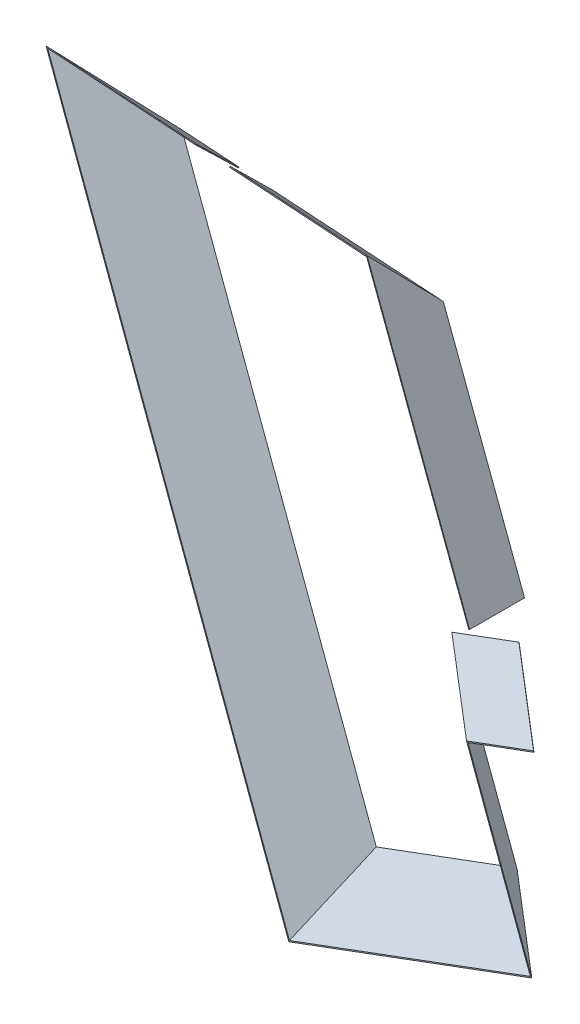
ISO-10303-21;
HEADER;
FILE_DESCRIPTION(('STEP AP214'),'2;1');
FILE_NAME('part.step','',(''),(''),'','','');
FILE_SCHEMA(('AUTOMOTIVE_DESIGN { 1 0 10303 214 1 1 1 1 }'));
ENDSEC;
DATA;
#1=APPLICATION_CONTEXT('core data for automotive mechanical design processes');
#2=APPLICATION_PROTOCOL_DEFINITION('international standard','automotive_design',2000,#1);
#3=PRODUCT_CONTEXT('',#1,'mechanical');
#4=PRODUCT('Part','Part','',(#3));
#5=PRODUCT_RELATED_PRODUCT_CATEGORY('part','',(#4));
#6=PRODUCT_DEFINITION_FORMATION('','',#4);
#7=PRODUCT_DEFINITION_CONTEXT('part definition',#1,'design');
#8=PRODUCT_DEFINITION('design','',#6,#7);
#9=PRODUCT_DEFINITION_SHAPE('','',#8);
#10=(LENGTH_UNIT() NAMED_UNIT(*) SI_UNIT(.MILLI.,.METRE.));
#11=(NAMED_UNIT(*) PLANE_ANGLE_UNIT() SI_UNIT($,.RADIAN.));
#12=(NAMED_UNIT(*) SI_UNIT($,.STERADIAN.) SOLID_ANGLE_UNIT());
#13=UNCERTAINTY_MEASURE_WITH_UNIT(LENGTH_MEASURE(1.E-05),#10,'distance_accuracy_value','');
#14=(GEOMETRIC_REPRESENTATION_CONTEXT(3) GLOBAL_UNCERTAINTY_ASSIGNED_CONTEXT((#13)) GLOBAL_UNIT_ASSIGNED_CONTEXT((#10,
#11,#12)) REPRESENTATION_CONTEXT('',''));
#15=CARTESIAN_POINT('',(0.,0.,0.));
#16=DIRECTION('',(0.,0.,1.));
#17=DIRECTION('',(1.,0.,0.));
#18=AXIS2_PLACEMENT_3D('',#15,#16,#17);
#19=CARTESIAN_POINT('',(74484.3531995962,28002.7639113801,2.23020576184523E-09));
#20=DIRECTION('',(0.936034964792815,0.351907011418235,0.));
#21=DIRECTION('',(-0.351907011418235,0.936034964792815,0.));
#22=AXIS2_PLACEMENT_3D('',#19,#20,#21);
#23=PLANE('',#22);
#24=DIRECTION('',(-0.351907011418235,0.936034964792815,0.));
#25=VECTOR('',#24,1.);
#26=CARTESIAN_POINT('',(49986.4237664351,93164.6327302221,-1.42554691415152E-11));
#27=LINE('',#26,#25);
#28=CARTESIAN_POINT('',(50090.9368637953,92886.6390835094,0.));
#29=VERTEX_POINT('',#28);
#30=CARTESIAN_POINT('',(49986.4237664351,93164.6327302221,-1.42554691415152E-11));
#31=VERTEX_POINT('',#30);
#32=EDGE_CURVE('E167',#29,#31,#27,.T.);
#33=ORIENTED_EDGE('',*,*,#32,.F.);
#34=DIRECTION('',(-0.260150224686482,0.691971738283521,0.67342183957194));
#35=VECTOR('',#34,1.);
#36=CARTESIAN_POINT('',(50090.9368637953,92886.6390835094,0.));
#37=LINE('',#36,#35);
#38=CARTESIAN_POINT('',(54796.2041279153,80371.1320461216,-12180.));
#39=VERTEX_POINT('',#38);
#40=EDGE_CURVE('E178',#39,#29,#37,.T.);
#41=ORIENTED_EDGE('',*,*,#40,.F.);
#42=DIRECTION('',(0.351907011418277,-0.936034964792799,0.));
#43=VECTOR('',#42,1.);
#44=CARTESIAN_POINT('',(54691.6910305552,80649.1256928343,-12180.));
#45=LINE('',#44,#43);
#46=CARTESIAN_POINT('',(54691.6910305552,80649.1256928343,-12180.));
#47=VERTEX_POINT('',#46);
#48=EDGE_CURVE('E169',#47,#39,#45,.T.);
#49=ORIENTED_EDGE('',*,*,#48,.F.);
#50=DIRECTION('',(0.260150224686481,-0.691971738283521,-0.67342183957194));
#51=VECTOR('',#50,1.);
#52=CARTESIAN_POINT('',(49986.4237664351,93164.6327302221,-1.42554691415152E-11));
#53=LINE('',#52,#51);
#54=EDGE_CURVE('E159',#31,#47,#53,.T.);
#55=ORIENTED_EDGE('',*,*,#54,.F.);
#56=EDGE_LOOP('',(#33,#41,#49,#55));
#57=FACE_BOUND('',#56,.T.);
#58=ADVANCED_FACE('F117',(#57),#23,.T.);
#59=CARTESIAN_POINT('',(-2250.07372456547,96326.5072499758,0.));
#60=DIRECTION('',(0.0463712521045221,0.705584656138623,-0.707106781186547));
#61=DIRECTION('',(0.,0.707868252835824,0.706344488636499));
#62=AXIS2_PLACEMENT_3D('',#59,#60,#61);
#63=PLANE('',#62);
#64=DIRECTION('',(0.997847390113597,-0.065578853630437,0.));
#65=VECTOR('',#64,1.);
#66=CARTESIAN_POINT('',(-2250.07372456547,96326.5072499758,0.));
#67=LINE('',#66,#65);
#68=CARTESIAN_POINT('',(19720.1344878937,94882.6180512166,2.22044604925031E-13));
#69=VERTEX_POINT('',#68);
#70=EDGE_CURVE('E172',#69,#29,#67,.T.);
#71=ORIENTED_EDGE('',*,*,#70,.F.);
#72=DIRECTION('',(-0.153049280511773,-0.694492078488884,-0.703033904339626));
#73=VECTOR('',#72,1.);
#74=CARTESIAN_POINT('',(19358.9756907871,93243.7869320606,-1658.98773497955));
#75=LINE('',#74,#73);
#76=CARTESIAN_POINT('',(17068.569285808,82850.6044260128,-12180.));
#77=VERTEX_POINT('',#76);
#78=EDGE_CURVE('E121',#69,#77,#75,.T.);
#79=ORIENTED_EDGE('',*,*,#78,.T.);
#80=DIRECTION('',(0.997847390113597,-0.065578853630437,0.));
#81=VECTOR('',#80,1.);
#82=CARTESIAN_POINT('',(2455.19353955456,83811.0002125879,-12180.));
#83=LINE('',#82,#81);
#84=EDGE_CURVE('E181',#77,#39,#83,.T.);
#85=ORIENTED_EDGE('',*,*,#84,.T.);
#86=ORIENTED_EDGE('',*,*,#40,.T.);
#87=EDGE_LOOP('',(#71,#79,#85,#86));
#88=FACE_BOUND('',#87,.T.);
#89=ADVANCED_FACE('F190',(#88),#63,.F.);
#90=CARTESIAN_POINT('',(2350.68044219438,84088.9938593006,-12180.));
#91=DIRECTION('',(0.,0.,1.));
#92=DIRECTION('',(0.,-1.,0.));
#93=AXIS2_PLACEMENT_3D('',#90,#91,#92);
#94=PLANE('',#93);
#95=ORIENTED_EDGE('',*,*,#84,.F.);
#96=DIRECTION('',(0.215211864822324,0.976567382846518,0.));
#97=VECTOR('',#96,1.);
#98=CARTESIAN_POINT('',(16647.164315719,80938.3941066698,-12179.9999999999));
#99=LINE('',#98,#97);
#100=CARTESIAN_POINT('',(17127.4656835186,83117.8587477893,-12180.));
#101=VERTEX_POINT('',#100);
#102=EDGE_CURVE('E187',#77,#101,#99,.T.);
#103=ORIENTED_EDGE('',*,*,#102,.T.);
#104=DIRECTION('',(0.997847390113597,-0.065578853630437,0.));
#105=VECTOR('',#104,1.);
#106=CARTESIAN_POINT('',(2350.68044219438,84088.9938593006,-12180.));
#107=LINE('',#106,#105);
#108=EDGE_CURVE('E163',#101,#47,#107,.T.);
#109=ORIENTED_EDGE('',*,*,#108,.T.);
#110=ORIENTED_EDGE('',*,*,#48,.T.);
#111=EDGE_LOOP('',(#95,#103,#109,#110));
#112=FACE_BOUND('',#111,.T.);
#113=ADVANCED_FACE('F186',(#112),#94,.F.);
#114=CARTESIAN_POINT('',(-2354.58682192564,96604.5008966884,-1.42554691415152E-11));
#115=DIRECTION('',(-0.0463712521045221,-0.705584656138623,0.707106781186547));
#116=DIRECTION('',(0.,-0.707868252835824,-0.706344488636499));
#117=AXIS2_PLACEMENT_3D('',#114,#115,#116);
#118=PLANE('',#117);
#119=ORIENTED_EDGE('',*,*,#108,.F.);
#120=DIRECTION('',(0.153049280511773,0.694492078488884,0.703033904339626));
#121=VECTOR('',#120,1.);
#122=CARTESIAN_POINT('',(19415.1858701376,93498.8519944957,-1671.32691472151));
#123=LINE('',#122,#121);
#124=CARTESIAN_POINT('',(19779.0308856043,95149.8723729931,-1.3988810110277E-11));
#125=VERTEX_POINT('',#124);
#126=EDGE_CURVE('E126',#101,#125,#123,.T.);
#127=ORIENTED_EDGE('',*,*,#126,.T.);
#128=DIRECTION('',(0.997847390113597,-0.065578853630437,0.));
#129=VECTOR('',#128,1.);
#130=CARTESIAN_POINT('',(-2354.58682192564,96604.5008966884,-1.42554691415152E-11));
#131=LINE('',#130,#129);
#132=EDGE_CURVE('E156',#125,#31,#131,.T.);
#133=ORIENTED_EDGE('',*,*,#132,.T.);
#134=ORIENTED_EDGE('',*,*,#54,.T.);
#135=EDGE_LOOP('',(#119,#127,#133,#134));
#136=FACE_BOUND('',#135,.T.);
#137=ADVANCED_FACE('F158',(#136),#118,.F.);
#138=CARTESIAN_POINT('',(-2354.58682192564,96604.5008966884,-1.42554691415152E-11));
#139=DIRECTION('',(0.,0.,-1.));
#140=DIRECTION('',(0.,1.,0.));
#141=AXIS2_PLACEMENT_3D('',#138,#139,#140);
#142=PLANE('',#141);
#143=ORIENTED_EDGE('',*,*,#132,.F.);
#144=DIRECTION('',(-0.215211864822324,-0.976567382846518,0.));
#145=VECTOR('',#144,1.);
#146=CARTESIAN_POINT('',(19059.6046582034,91885.3302966345,1.60399321255634E-10));
#147=LINE('',#146,#145);
#148=EDGE_CURVE('E51',#125,#69,#147,.T.);
#149=ORIENTED_EDGE('',*,*,#148,.T.);
#150=ORIENTED_EDGE('',*,*,#70,.T.);
#151=ORIENTED_EDGE('',*,*,#32,.T.);
#152=EDGE_LOOP('',(#143,#149,#150,#151));
#153=FACE_BOUND('',#152,.T.);
#154=ADVANCED_FACE('F119',(#153),#142,.F.);
#155=CARTESIAN_POINT('',(21089.3356866246,101095.645536197,-12180.));
#156=DIRECTION('',(0.976567382846518,-0.215211864822324,0.));
#157=DIRECTION('',(0.215211864822324,0.976567382846518,0.));
#158=AXIS2_PLACEMENT_3D('',#155,#156,#157);
#159=PLANE('',#158);
#160=ORIENTED_EDGE('',*,*,#126,.F.);
#161=ORIENTED_EDGE('',*,*,#102,.F.);
#162=ORIENTED_EDGE('',*,*,#78,.F.);
#163=ORIENTED_EDGE('',*,*,#148,.F.);
#164=EDGE_LOOP('',(#160,#161,#162,#163));
#165=FACE_BOUND('',#164,.T.);
#166=ADVANCED_FACE('F204',(#165),#159,.F.);
#167=CLOSED_SHELL('',(#58,#89,#113,#137,#154,#166));
#168=MANIFOLD_SOLID_BREP('B6',#167);
#169=CARTESIAN_POINT('',(-1207.69140198509,3012.92936787344,9.91028632743769E-13));
#170=DIRECTION('',(0.372059755013049,-0.928208779693249,0.));
#171=DIRECTION('',(0.928208779693249,0.372059755013049,0.));
#172=AXIS2_PLACEMENT_3D('',#169,#170,#171);
#173=PLANE('',#172);
#174=DIRECTION('',(0.,0.,1.));
#175=VECTOR('',#174,1.);
#176=CARTESIAN_POINT('',(72921.9529815773,32726.7803160055,0.));
#177=LINE('',#176,#175);
#178=CARTESIAN_POINT('',(72921.9529815773,32726.7803160055,-12180.));
#179=VERTEX_POINT('',#178);
#180=CARTESIAN_POINT('',(72921.9529815773,32726.7803160055,0.));
#181=VERTEX_POINT('',#180);
#182=EDGE_CURVE('E307',#179,#181,#177,.T.);
#183=ORIENTED_EDGE('',*,*,#182,.T.);
#184=DIRECTION('',(-0.928208779693282,-0.372059755012967,0.));
#185=VECTOR('',#184,1.);
#186=CARTESIAN_POINT('',(72921.9529815773,32726.7803160055,0.));
#187=LINE('',#186,#185);
#188=CARTESIAN_POINT('',(72736.3112256387,32652.3683650029,0.));
#189=VERTEX_POINT('',#188);
#190=EDGE_CURVE('E298',#181,#189,#187,.T.);
#191=ORIENTED_EDGE('',*,*,#190,.T.);
#192=DIRECTION('',(0.,0.,-1.));
#193=VECTOR('',#192,1.);
#194=CARTESIAN_POINT('',(72736.3112256387,32652.3683650029,0.));
#195=LINE('',#194,#193);
#196=CARTESIAN_POINT('',(72736.3112256387,32652.3683650029,-12180.));
#197=VERTEX_POINT('',#196);
#198=EDGE_CURVE('E289',#189,#197,#195,.T.);
#199=ORIENTED_EDGE('',*,*,#198,.T.);
#200=DIRECTION('',(0.928208779693282,0.372059755012967,0.));
#201=VECTOR('',#200,1.);
#202=CARTESIAN_POINT('',(72921.9529815773,32726.7803160055,-12180.));
#203=LINE('',#202,#201);
#204=EDGE_CURVE('E304',#197,#179,#203,.T.);
#205=ORIENTED_EDGE('',*,*,#204,.T.);
#206=EDGE_LOOP('',(#183,#191,#199,#205));
#207=FACE_BOUND('',#206,.T.);
#208=ADVANCED_FACE('F250',(#207),#173,.T.);
#209=CARTESIAN_POINT('',(72921.9529815773,32726.7803160055,0.));
#210=DIRECTION('',(0.,0.,-1.));
#211=DIRECTION('',(0.,1.,0.));
#212=AXIS2_PLACEMENT_3D('',#209,#210,#211);
#213=PLANE('',#212);
#214=DIRECTION('',(-0.351907011418259,0.936034964792806,0.));
#215=VECTOR('',#214,1.);
#216=CARTESIAN_POINT('',(72921.9529815773,32726.7803160055,0.));
#217=LINE('',#216,#215);
#218=CARTESIAN_POINT('',(50205.4528103945,93150.2380705207,-1.42222425842723E-11));
#219=VERTEX_POINT('',#218);
#220=EDGE_CURVE('E321',#181,#219,#217,.T.);
#221=ORIENTED_EDGE('',*,*,#220,.T.);
#222=DIRECTION('',(0.997847390113597,-0.0655788536304366,0.));
#223=VECTOR('',#222,1.);
#224=CARTESIAN_POINT('',(76778.2300908872,91403.8665420716,-1.01911703143507E-11));
#225=LINE('',#224,#223);
#226=CARTESIAN_POINT('',(49986.4237664351,93164.6327302221,-1.42554691415152E-11));
#227=VERTEX_POINT('',#226);
#228=EDGE_CURVE('E253',#219,#227,#225,.F.);
#229=ORIENTED_EDGE('',*,*,#228,.T.);
#230=DIRECTION('',(-0.351907011418259,0.936034964792806,0.));
#231=VECTOR('',#230,1.);
#232=CARTESIAN_POINT('',(72736.3112256387,32652.3683650029,0.));
#233=LINE('',#232,#231);
#234=EDGE_CURVE('E293',#189,#227,#233,.T.);
#235=ORIENTED_EDGE('',*,*,#234,.F.);
#236=ORIENTED_EDGE('',*,*,#190,.F.);
#237=EDGE_LOOP('',(#221,#229,#235,#236));
#238=FACE_BOUND('',#237,.T.);
#239=ADVANCED_FACE('F302',(#238),#213,.F.);
#240=CARTESIAN_POINT('',(72736.3112256387,32652.3683650029,0.));
#241=DIRECTION('',(0.936034964792806,0.351907011418259,0.));
#242=DIRECTION('',(-0.351907011418259,0.936034964792806,0.));
#243=AXIS2_PLACEMENT_3D('',#240,#241,#242);
#244=PLANE('',#243);
#245=ORIENTED_EDGE('',*,*,#234,.T.);
#246=DIRECTION('',(-0.260150224686481,0.69197173828352,0.67342183957194));
#247=VECTOR('',#246,1.);
#248=CARTESIAN_POINT('',(62419.3061037659,60094.4971452716,-32183.6143131414));
#249=LINE('',#248,#247);
#250=CARTESIAN_POINT('',(54691.6910305552,80649.1256928343,-12180.));
#251=VERTEX_POINT('',#250);
#252=EDGE_CURVE('E309',#227,#251,#249,.F.);
#253=ORIENTED_EDGE('',*,*,#252,.T.);
#254=DIRECTION('',(-0.351907011418259,0.936034964792806,0.));
#255=VECTOR('',#254,1.);
#256=CARTESIAN_POINT('',(72736.3112256387,32652.3683650029,-12180.));
#257=LINE('',#256,#255);
#258=EDGE_CURVE('E294',#197,#251,#257,.T.);
#259=ORIENTED_EDGE('',*,*,#258,.F.);
#260=ORIENTED_EDGE('',*,*,#198,.F.);
#261=EDGE_LOOP('',(#245,#253,#259,#260));
#262=FACE_BOUND('',#261,.T.);
#263=ADVANCED_FACE('F291',(#262),#244,.F.);
#264=CARTESIAN_POINT('',(72921.9529815773,32726.7803160055,-12180.));
#265=DIRECTION('',(0.,0.,1.));
#266=DIRECTION('',(0.,-1.,0.));
#267=AXIS2_PLACEMENT_3D('',#264,#265,#266);
#268=PLANE('',#267);
#269=ORIENTED_EDGE('',*,*,#258,.T.);
#270=DIRECTION('',(-0.997847390113597,0.0655788536304366,0.));
#271=VECTOR('',#270,1.);
#272=CARTESIAN_POINT('',(75979.4796536685,79250.085330488,-12180.));
#273=LINE('',#272,#271);
#274=CARTESIAN_POINT('',(54910.7200745146,80634.7310331328,-12180.));
#275=VERTEX_POINT('',#274);
#276=EDGE_CURVE('E258',#251,#275,#273,.F.);
#277=ORIENTED_EDGE('',*,*,#276,.T.);
#278=DIRECTION('',(-0.351907011418259,0.936034964792806,0.));
#279=VECTOR('',#278,1.);
#280=CARTESIAN_POINT('',(72921.9529815773,32726.7803160055,-12180.));
#281=LINE('',#280,#279);
#282=EDGE_CURVE('E327',#179,#275,#281,.T.);
#283=ORIENTED_EDGE('',*,*,#282,.F.);
#284=ORIENTED_EDGE('',*,*,#204,.F.);
#285=EDGE_LOOP('',(#269,#277,#283,#284));
#286=FACE_BOUND('',#285,.T.);
#287=ADVANCED_FACE('F344',(#286),#268,.F.);
#288=CARTESIAN_POINT('',(72921.9529815773,32726.7803160055,0.));
#289=DIRECTION('',(-0.936034964792806,-0.351907011418259,0.));
#290=DIRECTION('',(0.351907011418259,-0.936034964792806,0.));
#291=AXIS2_PLACEMENT_3D('',#288,#289,#290);
#292=PLANE('',#291);
#293=ORIENTED_EDGE('',*,*,#282,.T.);
#294=DIRECTION('',(0.260150224686481,-0.69197173828352,-0.67342183957194));
#295=VECTOR('',#294,1.);
#296=CARTESIAN_POINT('',(62620.0888937925,60128.6355670476,-32136.382272871));
#297=LINE('',#296,#295);
#298=EDGE_CURVE('E115',#275,#219,#297,.F.);
#299=ORIENTED_EDGE('',*,*,#298,.T.);
#300=ORIENTED_EDGE('',*,*,#220,.F.);
#301=ORIENTED_EDGE('',*,*,#182,.F.);
#302=EDGE_LOOP('',(#293,#299,#300,#301));
#303=FACE_BOUND('',#302,.T.);
#304=ADVANCED_FACE('F339',(#303),#292,.F.);
#305=CARTESIAN_POINT('',(17710.8971072945,85765.2968853547,-9500.));
#306=DIRECTION('',(0.0463712521045218,0.705584656138623,-0.707106781186547));
#307=DIRECTION('',(-0.997847390113597,0.0655788536304367,0.));
#308=AXIS2_PLACEMENT_3D('',#305,#306,#307);
#309=PLANE('',#308);
#310=ORIENTED_EDGE('',*,*,#276,.F.);
#311=ORIENTED_EDGE('',*,*,#252,.F.);
#312=ORIENTED_EDGE('',*,*,#228,.F.);
#313=ORIENTED_EDGE('',*,*,#298,.F.);
#314=EDGE_LOOP('',(#310,#311,#312,#313));
#315=FACE_BOUND('',#314,.T.);
#316=ADVANCED_FACE('F337',(#315),#309,.T.);
#317=CLOSED_SHELL('',(#208,#239,#263,#287,#304,#316));
#318=MANIFOLD_SOLID_BREP('B45',#317);
#319=CARTESIAN_POINT('',(66430.3395843483,-6709.42532160216,-27869.9360576518));
#320=DIRECTION('',(-0.667876107579125,-0.247760491521297,0.701823513261049));
#321=DIRECTION('',(0.724409654264499,0.,0.689369750430339));
#322=AXIS2_PLACEMENT_3D('',#319,#320,#321);
#323=PLANE('',#322);
#324=DIRECTION('',(-0.347806822958508,0.937566218409937,0.));
#325=VECTOR('',#324,1.);
#326=CARTESIAN_POINT('',(87186.6595025967,16285.0652393978,0.));
#327=LINE('',#326,#325);
#328=CARTESIAN_POINT('',(87186.6595025967,16285.0652393978,0.));
#329=VERTEX_POINT('',#328);
#330=CARTESIAN_POINT('',(87101.6762310583,16514.1505800665,6.88395498658696E-12));
#331=VERTEX_POINT('',#330);
#332=EDGE_CURVE('E510',#329,#331,#327,.T.);
#333=ORIENTED_EDGE('',*,*,#332,.F.);
#334=DIRECTION('',(0.73840010299375,-0.338795341373596,0.583080615834867));
#335=VECTOR('',#334,1.);
#336=CARTESIAN_POINT('',(87186.6595025967,16285.0652393978,0.));
#337=LINE('',#336,#335);
#338=CARTESIAN_POINT('',(71762.1830061751,23362.1779848146,-12180.0000000001));
#339=VERTEX_POINT('',#338);
#340=EDGE_CURVE('E522',#339,#329,#337,.T.);
#341=ORIENTED_EDGE('',*,*,#340,.F.);
#342=DIRECTION('',(0.347806822958527,-0.937566218409929,0.));
#343=VECTOR('',#342,1.);
#344=CARTESIAN_POINT('',(71762.1830061751,23362.1779848146,-12180.0000000001));
#345=LINE('',#344,#343);
#346=CARTESIAN_POINT('',(71677.1997346367,23591.2633254833,-12180.0000000001));
#347=VERTEX_POINT('',#346);
#348=EDGE_CURVE('E525',#347,#339,#345,.T.);
#349=ORIENTED_EDGE('',*,*,#348,.F.);
#350=DIRECTION('',(-0.73840010299375,0.338795341373596,-0.583080615834867));
#351=VECTOR('',#350,1.);
#352=CARTESIAN_POINT('',(87101.6762310583,16514.1505800665,6.88395498658696E-12));
#353=LINE('',#352,#351);
#354=EDGE_CURVE('E513',#331,#347,#353,.T.);
#355=ORIENTED_EDGE('',*,*,#354,.F.);
#356=EDGE_LOOP('',(#333,#341,#349,#355));
#357=FACE_BOUND('',#356,.T.);
#358=ADVANCED_FACE('F390',(#357),#323,.F.);
#359=CARTESIAN_POINT('',(-20997.0947104008,97829.6925524821,0.));
#360=DIRECTION('',(0.,0.,1.));
#361=DIRECTION('',(0.,-1.,0.));
#362=AXIS2_PLACEMENT_3D('',#359,#360,#361);
#363=PLANE('',#362);
#364=DIRECTION('',(-0.215211864822325,-0.976567382846518,0.));
#365=VECTOR('',#364,1.);
#366=CARTESIAN_POINT('',(11101.8985978516,90755.8496921435,1.42471575761771E-10));
#367=LINE('',#366,#365);
#368=CARTESIAN_POINT('',(12180.2889578403,95649.264153333,0.));
#369=VERTEX_POINT('',#368);
#370=CARTESIAN_POINT('',(12127.0964616619,95407.8924388931,7.73261163243193E-12));
#371=VERTEX_POINT('',#370);
#372=EDGE_CURVE('E492',#369,#371,#367,.T.);
#373=ORIENTED_EDGE('',*,*,#372,.F.);
#374=DIRECTION('',(0.997847390113597,-0.0655788536304367,0.));
#375=VECTOR('',#374,1.);
#376=CARTESIAN_POINT('',(-20997.0947104008,97829.6925524821,0.));
#377=LINE('',#376,#375);
#378=CARTESIAN_POINT('',(-20997.0947104008,97829.692552482,0.));
#379=VERTEX_POINT('',#378);
#380=EDGE_CURVE('E480',#379,#369,#377,.T.);
#381=ORIENTED_EDGE('',*,*,#380,.F.);
#382=DIRECTION('',(-0.801739862033479,0.597673149494386,0.));
#383=VECTOR('',#382,1.);
#384=CARTESIAN_POINT('',(83136.8934015715,20200.9109593642,2.03148208592562E-09));
#385=LINE('',#384,#383);
#386=CARTESIAN_POINT('',(-20636.8628623338,97561.1504562511,7.02752827771276E-12));
#387=VERTEX_POINT('',#386);
#388=EDGE_CURVE('E591',#387,#379,#385,.T.);
#389=ORIENTED_EDGE('',*,*,#388,.F.);
#390=DIRECTION('',(0.997847390113597,-0.0655788536304367,0.));
#391=VECTOR('',#390,1.);
#392=CARTESIAN_POINT('',(-21013.118276235,97585.8780839028,7.02752827771268E-12));
#393=LINE('',#392,#391);
#394=EDGE_CURVE('E489',#387,#371,#393,.T.);
#395=ORIENTED_EDGE('',*,*,#394,.T.);
#396=EDGE_LOOP('',(#373,#381,#389,#395));
#397=FACE_BOUND('',#396,.T.);
#398=ADVANCED_FACE('F493',(#397),#363,.T.);
#399=CARTESIAN_POINT('',(-21013.118276235,97585.8780839028,7.02752827771268E-12));
#400=DIRECTION('',(-0.0467151531723035,-0.710817452443314,0.701823513261051));
#401=DIRECTION('',(0.,-0.702590565615678,-0.711594334651311));
#402=AXIS2_PLACEMENT_3D('',#399,#400,#401);
#403=PLANE('',#402);
#404=DIRECTION('',(-0.151918737121505,-0.689362009100096,-0.70830834932315));
#405=VECTOR('',#404,1.);
#406=CARTESIAN_POINT('',(11590.3373299298,92972.2392702012,-2502.59435922783));
#407=LINE('',#406,#405);
#408=CARTESIAN_POINT('',(9514.71695221789,83553.6918229287,-12180.0000000001));
#409=VERTEX_POINT('',#408);
#410=EDGE_CURVE('E404',#371,#409,#407,.T.);
#411=ORIENTED_EDGE('',*,*,#410,.F.);
#412=ORIENTED_EDGE('',*,*,#394,.F.);
#413=DIRECTION('',(-0.701913549116186,0.52325561125154,0.483240038553198));
#414=VECTOR('',#413,1.);
#415=CARTESIAN_POINT('',(58985.2025197936,38205.2760140286,-54816.6793380641));
#416=LINE('',#415,#414);
#417=CARTESIAN_POINT('',(-2945.2265198,84372.5633430536,-12180.0000000001));
#418=VERTEX_POINT('',#417);
#419=EDGE_CURVE('E574',#418,#387,#416,.T.);
#420=ORIENTED_EDGE('',*,*,#419,.F.);
#421=DIRECTION('',(0.997847390113597,-0.0655788536304367,0.));
#422=VECTOR('',#421,1.);
#423=CARTESIAN_POINT('',(-9825.89583843701,84824.7631589743,-12180.0000000001));
#424=LINE('',#423,#422);
#425=EDGE_CURVE('E605',#418,#409,#424,.T.);
#426=ORIENTED_EDGE('',*,*,#425,.T.);
#427=EDGE_LOOP('',(#411,#412,#420,#426));
#428=FACE_BOUND('',#427,.T.);
#429=ADVANCED_FACE('F606',(#428),#403,.T.);
#430=CARTESIAN_POINT('',(-9809.87227260283,85068.5776275536,-12180.0000000001));
#431=DIRECTION('',(0.,0.,-1.));
#432=DIRECTION('',(0.,1.,0.));
#433=AXIS2_PLACEMENT_3D('',#430,#431,#432);
#434=PLANE('',#433);
#435=DIRECTION('',(0.215211864822325,0.976567382846518,0.));
#436=VECTOR('',#435,1.);
#437=CARTESIAN_POINT('',(8938.05830597798,80936.9865338441,-12180.0000000001));
#438=LINE('',#437,#436);
#439=CARTESIAN_POINT('',(9567.90944839627,83795.0635373686,-12180.0000000001));
#440=VERTEX_POINT('',#439);
#441=EDGE_CURVE('E412',#409,#440,#438,.T.);
#442=ORIENTED_EDGE('',*,*,#441,.F.);
#443=ORIENTED_EDGE('',*,*,#425,.F.);
#444=DIRECTION('',(0.801739862033479,-0.597673149494386,0.));
#445=VECTOR('',#444,1.);
#446=CARTESIAN_POINT('',(80294.8923118157,22319.537988676,-12180.0000000001));
#447=LINE('',#446,#445);
#448=CARTESIAN_POINT('',(-3305.45836786699,84641.1054392845,-12180.0000000001));
#449=VERTEX_POINT('',#448);
#450=EDGE_CURVE('E587',#449,#418,#447,.T.);
#451=ORIENTED_EDGE('',*,*,#450,.F.);
#452=DIRECTION('',(0.997847390113597,-0.0655788536304367,0.));
#453=VECTOR('',#452,1.);
#454=CARTESIAN_POINT('',(-9809.87227260283,85068.5776275536,-12180.0000000001));
#455=LINE('',#454,#453);
#456=EDGE_CURVE('E495',#449,#440,#455,.T.);
#457=ORIENTED_EDGE('',*,*,#456,.T.);
#458=EDGE_LOOP('',(#442,#443,#451,#457));
#459=FACE_BOUND('',#458,.T.);
#460=ADVANCED_FACE('F607',(#459),#434,.T.);
#461=CARTESIAN_POINT('',(-20997.0947104008,97829.6925524821,0.));
#462=DIRECTION('',(0.0467151531723035,0.710817452443315,-0.701823513261051));
#463=DIRECTION('',(0.,0.702590565615677,0.711594334651311));
#464=AXIS2_PLACEMENT_3D('',#461,#462,#463);
#465=PLANE('',#464);
#466=DIRECTION('',(0.151918737121505,0.689362009100096,0.708308349323151));
#467=VECTOR('',#466,1.);
#468=CARTESIAN_POINT('',(11642.9278154412,93210.8792394281,-2505.40118338856));
#469=LINE('',#468,#467);
#470=EDGE_CURVE('E248',#440,#369,#469,.T.);
#471=ORIENTED_EDGE('',*,*,#470,.F.);
#472=ORIENTED_EDGE('',*,*,#456,.F.);
#473=DIRECTION('',(0.701913549116186,-0.52325561125154,-0.483240038553198));
#474=VECTOR('',#473,1.);
#475=CARTESIAN_POINT('',(58819.4271468703,38328.8566091014,-54950.5550192839));
#476=LINE('',#475,#474);
#477=EDGE_CURVE('E485',#379,#449,#476,.T.);
#478=ORIENTED_EDGE('',*,*,#477,.F.);
#479=ORIENTED_EDGE('',*,*,#380,.T.);
#480=EDGE_LOOP('',(#471,#472,#478,#479));
#481=FACE_BOUND('',#480,.T.);
#482=ADVANCED_FACE('F482',(#481),#465,.T.);
#483=CARTESIAN_POINT('',(32833.2447860134,-47278.1791335011,-3.19744231092045E-11));
#484=DIRECTION('',(-0.667876107579125,-0.247760491521293,-0.701823513261051));
#485=DIRECTION('',(-0.7244096542645,0.,0.689369750430338));
#486=AXIS2_PLACEMENT_3D('',#483,#484,#485);
#487=PLANE('',#486);
#488=DIRECTION('',(-0.347806822958529,0.937566218409929,0.));
#489=VECTOR('',#488,1.);
#490=CARTESIAN_POINT('',(32833.2447860134,-47278.1791335011,-3.19744231092045E-11));
#491=LINE('',#490,#489);
#492=CARTESIAN_POINT('',(32833.2447860134,-47278.1791335011,-3.19744231092045E-11));
#493=VERTEX_POINT('',#492);
#494=EDGE_CURVE('E595',#493,#379,#491,.T.);
#495=ORIENTED_EDGE('',*,*,#494,.T.);
#496=ORIENTED_EDGE('',*,*,#477,.T.);
#497=DIRECTION('',(-0.347806822958529,0.937566218409929,0.));
#498=VECTOR('',#497,1.);
#499=CARTESIAN_POINT('',(39910.3575314302,-31853.7026370795,-12180.0000000001));
#500=LINE('',#499,#498);
#501=CARTESIAN_POINT('',(39910.3575314302,-31853.7026370795,-12180.0000000001));
#502=VERTEX_POINT('',#501);
#503=EDGE_CURVE('E488',#502,#449,#500,.T.);
#504=ORIENTED_EDGE('',*,*,#503,.F.);
#505=DIRECTION('',(0.338795341373597,0.73840010299375,-0.583080615834867));
#506=VECTOR('',#505,1.);
#507=CARTESIAN_POINT('',(44015.6986682749,-22906.164261905,-19245.4597214311));
#508=LINE('',#507,#506);
#509=EDGE_CURVE('E566',#493,#502,#508,.T.);
#510=ORIENTED_EDGE('',*,*,#509,.F.);
#511=EDGE_LOOP('',(#495,#496,#504,#510));
#512=FACE_BOUND('',#511,.T.);
#513=ADVANCED_FACE('F728',(#512),#487,.T.);
#514=CARTESIAN_POINT('',(39910.3575314302,-31853.7026370795,-12180.0000000001));
#515=DIRECTION('',(0.,0.,-1.));
#516=DIRECTION('',(0.,1.,0.));
#517=AXIS2_PLACEMENT_3D('',#514,#515,#516);
#518=PLANE('',#517);
#519=ORIENTED_EDGE('',*,*,#503,.T.);
#520=ORIENTED_EDGE('',*,*,#450,.T.);
#521=DIRECTION('',(-0.347806822958529,0.937566218409929,0.));
#522=VECTOR('',#521,1.);
#523=CARTESIAN_POINT('',(40139.4428720989,-31768.7193655411,-12180.0000000001));
#524=LINE('',#523,#522);
#525=CARTESIAN_POINT('',(40054.4596005605,-31539.6340248725,-12180.0000000001));
#526=VERTEX_POINT('',#525);
#527=EDGE_CURVE('E594',#526,#418,#524,.T.);
#528=ORIENTED_EDGE('',*,*,#527,.F.);
#529=DIRECTION('',(0.417022867792164,0.908895993906013,0.));
#530=VECTOR('',#529,1.);
#531=CARTESIAN_POINT('',(49775.9204437014,-10351.83475136,-12180.0000000001));
#532=LINE('',#531,#530);
#533=EDGE_CURVE('E563',#502,#526,#532,.T.);
#534=ORIENTED_EDGE('',*,*,#533,.F.);
#535=EDGE_LOOP('',(#519,#520,#528,#534));
#536=FACE_BOUND('',#535,.T.);
#537=ADVANCED_FACE('F610',(#536),#518,.T.);
#538=CARTESIAN_POINT('',(33062.330126682,-47193.1958619627,-2.48689957516035E-11));
#539=DIRECTION('',(0.667876107579125,0.247760491521293,0.701823513261051));
#540=DIRECTION('',(0.724409654264501,0.,-0.689369750430338));
#541=AXIS2_PLACEMENT_3D('',#538,#539,#540);
#542=PLANE('',#541);
#543=ORIENTED_EDGE('',*,*,#527,.T.);
#544=ORIENTED_EDGE('',*,*,#419,.T.);
#545=DIRECTION('',(-0.347806822958529,0.937566218409929,0.));
#546=VECTOR('',#545,1.);
#547=CARTESIAN_POINT('',(33062.330126682,-47193.1958619627,-2.48689957516035E-11));
#548=LINE('',#547,#546);
#549=CARTESIAN_POINT('',(32977.3468551437,-46964.110521294,-2.48185169490027E-11));
#550=VERTEX_POINT('',#549);
#551=EDGE_CURVE('E598',#550,#387,#548,.T.);
#552=ORIENTED_EDGE('',*,*,#551,.F.);
#553=DIRECTION('',(-0.338795341373597,-0.73840010299375,0.583080615834866));
#554=VECTOR('',#553,1.);
#555=CARTESIAN_POINT('',(44112.2458300534,-22695.740960593,-19163.6157841672));
#556=LINE('',#555,#554);
#557=EDGE_CURVE('E550',#526,#550,#556,.T.);
#558=ORIENTED_EDGE('',*,*,#557,.F.);
#559=EDGE_LOOP('',(#543,#544,#552,#558));
#560=FACE_BOUND('',#559,.T.);
#561=ADVANCED_FACE('F613',(#560),#542,.T.);
#562=CARTESIAN_POINT('',(32833.2447860134,-47278.1791335011,-3.19744231092045E-11));
#563=DIRECTION('',(0.,0.,1.));
#564=DIRECTION('',(1.,0.,0.));
#565=AXIS2_PLACEMENT_3D('',#562,#563,#564);
#566=PLANE('',#565);
#567=ORIENTED_EDGE('',*,*,#551,.T.);
#568=ORIENTED_EDGE('',*,*,#388,.T.);
#569=ORIENTED_EDGE('',*,*,#494,.F.);
#570=DIRECTION('',(-0.417022867792164,-0.908895993906013,0.));
#571=VECTOR('',#570,1.);
#572=CARTESIAN_POINT('',(49775.9204437014,-10351.8347513599,8.09375030378074E-10));
#573=LINE('',#572,#571);
#574=EDGE_CURVE('E569',#550,#493,#573,.T.);
#575=ORIENTED_EDGE('',*,*,#574,.F.);
#576=EDGE_LOOP('',(#567,#568,#569,#575));
#577=FACE_BOUND('',#576,.T.);
#578=ADVANCED_FACE('F755',(#577),#566,.T.);
#579=CARTESIAN_POINT('',(86702.2648258425,-27294.5104090479,0.));
#580=DIRECTION('',(0.247760491521294,-0.667876107579125,-0.701823513261051));
#581=DIRECTION('',(0.,0.7244096542645,-0.689369750430338));
#582=AXIS2_PLACEMENT_3D('',#579,#580,#581);
#583=PLANE('',#582);
#584=DIRECTION('',(-0.937566218409929,-0.347806822958529,0.));
#585=VECTOR('',#584,1.);
#586=CARTESIAN_POINT('',(86702.2648258425,-27294.5104090479,0.));
#587=LINE('',#586,#585);
#588=CARTESIAN_POINT('',(86702.2648258425,-27294.5104090479,0.));
#589=VERTEX_POINT('',#588);
#590=EDGE_CURVE('E575',#589,#493,#587,.T.);
#591=ORIENTED_EDGE('',*,*,#590,.T.);
#592=ORIENTED_EDGE('',*,*,#509,.T.);
#593=DIRECTION('',(-0.937566218409929,-0.347806822958529,0.));
#594=VECTOR('',#593,1.);
#595=CARTESIAN_POINT('',(71277.7883294209,-20217.3976636311,-12180.0000000001));
#596=LINE('',#595,#594);
#597=CARTESIAN_POINT('',(71277.7883294209,-20217.3976636311,-12180.0000000001));
#598=VERTEX_POINT('',#597);
#599=EDGE_CURVE('E570',#598,#502,#596,.T.);
#600=ORIENTED_EDGE('',*,*,#599,.F.);
#601=DIRECTION('',(-0.738400102993749,0.338795341373597,-0.583080615834867));
#602=VECTOR('',#601,1.);
#603=CARTESIAN_POINT('',(58129.5950278602,-14184.697207621,-22562.5238055998));
#604=LINE('',#603,#602);
#605=EDGE_CURVE('E542',#589,#598,#604,.T.);
#606=ORIENTED_EDGE('',*,*,#605,.F.);
#607=EDGE_LOOP('',(#591,#592,#600,#606));
#608=FACE_BOUND('',#607,.T.);
#609=ADVANCED_FACE('F762',(#608),#583,.T.);
#610=CARTESIAN_POINT('',(71277.7883294209,-20217.3976636311,-12180.0000000001));
#611=DIRECTION('',(0.,0.,-1.));
#612=DIRECTION('',(-1.,0.,0.));
#613=AXIS2_PLACEMENT_3D('',#610,#611,#612);
#614=PLANE('',#613);
#615=ORIENTED_EDGE('',*,*,#599,.T.);
#616=ORIENTED_EDGE('',*,*,#533,.T.);
#617=DIRECTION('',(-0.937566218409929,-0.347806822958529,0.));
#618=VECTOR('',#617,1.);
#619=CARTESIAN_POINT('',(71192.8050578825,-19988.3123229624,-12180.0000000001));
#620=LINE('',#619,#618);
#621=CARTESIAN_POINT('',(70963.7197172139,-20073.2955945008,-12180.0000000001));
#622=VERTEX_POINT('',#621);
#623=EDGE_CURVE('E573',#622,#526,#620,.T.);
#624=ORIENTED_EDGE('',*,*,#623,.F.);
#625=DIRECTION('',(-0.908895993906013,0.417022867792163,0.));
#626=VECTOR('',#625,1.);
#627=CARTESIAN_POINT('',(43411.455656547,-7431.66855490093,-12180.0000000001));
#628=LINE('',#627,#626);
#629=EDGE_CURVE('E539',#598,#622,#628,.T.);
#630=ORIENTED_EDGE('',*,*,#629,.F.);
#631=EDGE_LOOP('',(#615,#616,#624,#630));
#632=FACE_BOUND('',#631,.T.);
#633=ADVANCED_FACE('F646',(#632),#614,.T.);
#634=CARTESIAN_POINT('',(86617.2815543041,-27065.4250683793,7.01993057339437E-12));
#635=DIRECTION('',(-0.247760491521294,0.667876107579124,0.701823513261051));
#636=DIRECTION('',(0.,-0.724409654264501,0.689369750430338));
#637=AXIS2_PLACEMENT_3D('',#634,#635,#636);
#638=PLANE('',#637);
#639=ORIENTED_EDGE('',*,*,#623,.T.);
#640=ORIENTED_EDGE('',*,*,#557,.T.);
#641=DIRECTION('',(-0.937566218409929,-0.347806822958529,0.));
#642=VECTOR('',#641,1.);
#643=CARTESIAN_POINT('',(86617.2815543041,-27065.4250683793,7.01993057339437E-12));
#644=LINE('',#643,#642);
#645=CARTESIAN_POINT('',(86388.1962136354,-27150.4083399176,6.88395498658708E-12));
#646=VERTEX_POINT('',#645);
#647=EDGE_CURVE('E578',#646,#550,#644,.T.);
#648=ORIENTED_EDGE('',*,*,#647,.F.);
#649=DIRECTION('',(0.73840010299375,-0.338795341373597,0.583080615834867));
#650=VECTOR('',#649,1.);
#651=CARTESIAN_POINT('',(57919.1717265482,-14088.1500458425,-22480.6798683359));
#652=LINE('',#651,#650);
#653=EDGE_CURVE('E514',#622,#646,#652,.T.);
#654=ORIENTED_EDGE('',*,*,#653,.F.);
#655=EDGE_LOOP('',(#639,#640,#648,#654));
#656=FACE_BOUND('',#655,.T.);
#657=ADVANCED_FACE('F617',(#656),#638,.T.);
#658=CARTESIAN_POINT('',(86702.2648258425,-27294.5104090479,0.));
#659=DIRECTION('',(0.,0.,1.));
#660=DIRECTION('',(0.,-1.,0.));
#661=AXIS2_PLACEMENT_3D('',#658,#659,#660);
#662=PLANE('',#661);
#663=ORIENTED_EDGE('',*,*,#647,.T.);
#664=ORIENTED_EDGE('',*,*,#574,.T.);
#665=ORIENTED_EDGE('',*,*,#590,.F.);
#666=DIRECTION('',(0.908895993906013,-0.417022867792163,0.));
#667=VECTOR('',#666,1.);
#668=CARTESIAN_POINT('',(43411.455656547,-7431.66855490092,9.48875405154803E-10));
#669=LINE('',#668,#667);
#670=EDGE_CURVE('E545',#646,#589,#669,.T.);
#671=ORIENTED_EDGE('',*,*,#670,.F.);
#672=EDGE_LOOP('',(#663,#664,#665,#671));
#673=FACE_BOUND('',#672,.T.);
#674=ADVANCED_FACE('F620',(#673),#662,.T.);
#675=CARTESIAN_POINT('',(63274.2975106939,35859.1406143946,0.));
#676=DIRECTION('',(0.667876107579125,0.247760491521294,-0.701823513261051));
#677=DIRECTION('',(-0.7244096542645,0.,-0.689369750430339));
#678=AXIS2_PLACEMENT_3D('',#675,#676,#677);
#679=PLANE('',#678);
#680=DIRECTION('',(0.347806822958529,-0.937566218409929,0.));
#681=VECTOR('',#680,1.);
#682=CARTESIAN_POINT('',(63274.2975106939,35859.1406143946,0.));
#683=LINE('',#682,#681);
#684=CARTESIAN_POINT('',(72549.9140161737,10855.304817015,0.));
#685=VERTEX_POINT('',#684);
#686=EDGE_CURVE('E556',#685,#589,#683,.T.);
#687=ORIENTED_EDGE('',*,*,#686,.T.);
#688=ORIENTED_EDGE('',*,*,#605,.T.);
#689=DIRECTION('',(0.347806822958529,-0.937566218409929,0.));
#690=VECTOR('',#689,1.);
#691=CARTESIAN_POINT('',(56197.1847652771,20434.664117973,-12180.0000000001));
#692=LINE('',#691,#690);
#693=CARTESIAN_POINT('',(57125.4375197521,17932.4175624318,-12180.0000000001));
#694=VERTEX_POINT('',#693);
#695=EDGE_CURVE('E546',#694,#598,#692,.T.);
#696=ORIENTED_EDGE('',*,*,#695,.F.);
#697=DIRECTION('',(-0.738400102993749,0.338795341373596,-0.583080615834868));
#698=VECTOR('',#697,1.);
#699=CARTESIAN_POINT('',(79172.0314856044,7816.92150751149,5229.18173569));
#700=LINE('',#699,#698);
#701=EDGE_CURVE('E506',#685,#694,#700,.T.);
#702=ORIENTED_EDGE('',*,*,#701,.F.);
#703=EDGE_LOOP('',(#687,#688,#696,#702));
#704=FACE_BOUND('',#703,.T.);
#705=ADVANCED_FACE('F627',(#704),#679,.T.);
#706=CARTESIAN_POINT('',(56197.1847652771,20434.664117973,-12180.0000000001));
#707=DIRECTION('',(0.,0.,-1.));
#708=DIRECTION('',(-1.,0.,0.));
#709=AXIS2_PLACEMENT_3D('',#706,#707,#708);
#710=PLANE('',#709);
#711=ORIENTED_EDGE('',*,*,#695,.T.);
#712=ORIENTED_EDGE('',*,*,#629,.T.);
#713=DIRECTION('',(0.347806822958529,-0.937566218409929,0.));
#714=VECTOR('',#713,1.);
#715=CARTESIAN_POINT('',(55968.0994246085,20349.6808464346,-12180.0000000001));
#716=LINE('',#715,#714);
#717=CARTESIAN_POINT('',(56811.3689075451,18076.5196315621,-12180.0000000001));
#718=VERTEX_POINT('',#717);
#719=EDGE_CURVE('E549',#718,#622,#716,.T.);
#720=ORIENTED_EDGE('',*,*,#719,.F.);
#721=DIRECTION('',(-0.908895993906014,0.417022867792163,0.));
#722=VECTOR('',#721,1.);
#723=CARTESIAN_POINT('',(67158.690474155,13328.9250304117,-12180.0000000001));
#724=LINE('',#723,#722);
#725=EDGE_CURVE('E503',#694,#718,#724,.T.);
#726=ORIENTED_EDGE('',*,*,#725,.F.);
#727=EDGE_LOOP('',(#711,#712,#720,#726));
#728=FACE_BOUND('',#727,.T.);
#729=ADVANCED_FACE('F649',(#728),#710,.T.);
#730=CARTESIAN_POINT('',(63045.2121700253,35774.1573428562,6.88395498658696E-12));
#731=DIRECTION('',(-0.667876107579125,-0.247760491521294,0.701823513261051));
#732=DIRECTION('',(0.7244096542645,0.,0.689369750430339));
#733=AXIS2_PLACEMENT_3D('',#730,#731,#732);
#734=PLANE('',#733);
#735=ORIENTED_EDGE('',*,*,#719,.T.);
#736=ORIENTED_EDGE('',*,*,#653,.T.);
#737=DIRECTION('',(0.347806822958529,-0.937566218409929,0.));
#738=VECTOR('',#737,1.);
#739=CARTESIAN_POINT('',(63045.2121700253,35774.1573428562,6.88395498658696E-12));
#740=LINE('',#739,#738);
#741=CARTESIAN_POINT('',(72235.8454039666,10999.4068861452,6.88395498658692E-12));
#742=VERTEX_POINT('',#741);
#743=EDGE_CURVE('E553',#742,#646,#740,.T.);
#744=ORIENTED_EDGE('',*,*,#743,.F.);
#745=DIRECTION('',(0.73840010299375,-0.338795341373596,0.583080615834867));
#746=VECTOR('',#745,1.);
#747=CARTESIAN_POINT('',(78961.6081842925,7913.46866928992,5311.02567295393));
#748=LINE('',#747,#746);
#749=EDGE_CURVE('E397',#718,#742,#748,.T.);
#750=ORIENTED_EDGE('',*,*,#749,.F.);
#751=EDGE_LOOP('',(#735,#736,#744,#750));
#752=FACE_BOUND('',#751,.T.);
#753=ADVANCED_FACE('F643',(#752),#734,.T.);
#754=CARTESIAN_POINT('',(63274.2975106939,35859.1406143946,0.));
#755=DIRECTION('',(0.,0.,1.));
#756=DIRECTION('',(1.,0.,0.));
#757=AXIS2_PLACEMENT_3D('',#754,#755,#756);
#758=PLANE('',#757);
#759=ORIENTED_EDGE('',*,*,#743,.T.);
#760=ORIENTED_EDGE('',*,*,#670,.T.);
#761=ORIENTED_EDGE('',*,*,#686,.F.);
#762=DIRECTION('',(0.908895993906014,-0.417022867792163,0.));
#763=VECTOR('',#762,1.);
#764=CARTESIAN_POINT('',(82583.1669705766,6251.81228499487,-2.199152001271E-10));
#765=LINE('',#764,#763);
#766=EDGE_CURVE('E509',#742,#685,#765,.T.);
#767=ORIENTED_EDGE('',*,*,#766,.F.);
#768=EDGE_LOOP('',(#759,#760,#761,#767));
#769=FACE_BOUND('',#768,.T.);
#770=ADVANCED_FACE('F624',(#769),#758,.T.);
#771=CARTESIAN_POINT('',(87186.6595025967,16285.0652393978,0.));
#772=DIRECTION('',(0.247760491521294,-0.667876107579125,-0.70182351326105));
#773=DIRECTION('',(0.,0.7244096542645,-0.689369750430339));
#774=AXIS2_PLACEMENT_3D('',#771,#772,#773);
#775=PLANE('',#774);
#776=DIRECTION('',(-0.937566218409929,-0.34780682295853,0.));
#777=VECTOR('',#776,1.);
#778=CARTESIAN_POINT('',(87186.6595025967,16285.0652393978,0.));
#779=LINE('',#778,#777);
#780=EDGE_CURVE('E519',#329,#685,#779,.T.);
#781=ORIENTED_EDGE('',*,*,#780,.T.);
#782=ORIENTED_EDGE('',*,*,#701,.T.);
#783=DIRECTION('',(-0.937566218409929,-0.34780682295853,0.));
#784=VECTOR('',#783,1.);
#785=CARTESIAN_POINT('',(71762.1830061751,23362.1779848146,-12180.0000000001));
#786=LINE('',#785,#784);
#787=EDGE_CURVE('E528',#339,#694,#786,.T.);
#788=ORIENTED_EDGE('',*,*,#787,.F.);
#789=ORIENTED_EDGE('',*,*,#340,.T.);
#790=EDGE_LOOP('',(#781,#782,#788,#789));
#791=FACE_BOUND('',#790,.T.);
#792=ADVANCED_FACE('F631',(#791),#775,.T.);
#793=CARTESIAN_POINT('',(71762.1830061751,23362.1779848146,-12180.0000000001));
#794=DIRECTION('',(0.,0.,-1.));
#795=DIRECTION('',(0.,1.,0.));
#796=AXIS2_PLACEMENT_3D('',#793,#794,#795);
#797=PLANE('',#796);
#798=ORIENTED_EDGE('',*,*,#787,.T.);
#799=ORIENTED_EDGE('',*,*,#725,.T.);
#800=DIRECTION('',(-0.937566218409929,-0.34780682295853,0.));
#801=VECTOR('',#800,1.);
#802=CARTESIAN_POINT('',(71677.1997346367,23591.2633254833,-12180.0000000001));
#803=LINE('',#802,#801);
#804=EDGE_CURVE('E518',#347,#718,#803,.T.);
#805=ORIENTED_EDGE('',*,*,#804,.F.);
#806=ORIENTED_EDGE('',*,*,#348,.T.);
#807=EDGE_LOOP('',(#798,#799,#805,#806));
#808=FACE_BOUND('',#807,.T.);
#809=ADVANCED_FACE('F634',(#808),#797,.T.);
#810=CARTESIAN_POINT('',(87101.6762310583,16514.1505800665,6.88395498658696E-12));
#811=DIRECTION('',(-0.247760491521294,0.667876107579125,0.701823513261051));
#812=DIRECTION('',(0.,-0.7244096542645,0.689369750430339));
#813=AXIS2_PLACEMENT_3D('',#810,#811,#812);
#814=PLANE('',#813);
#815=ORIENTED_EDGE('',*,*,#804,.T.);
#816=ORIENTED_EDGE('',*,*,#749,.T.);
#817=DIRECTION('',(-0.937566218409929,-0.34780682295853,0.));
#818=VECTOR('',#817,1.);
#819=CARTESIAN_POINT('',(87101.6762310583,16514.1505800665,6.88395498658696E-12));
#820=LINE('',#819,#818);
#821=EDGE_CURVE('E515',#331,#742,#820,.T.);
#822=ORIENTED_EDGE('',*,*,#821,.F.);
#823=ORIENTED_EDGE('',*,*,#354,.T.);
#824=EDGE_LOOP('',(#815,#816,#822,#823));
#825=FACE_BOUND('',#824,.T.);
#826=ADVANCED_FACE('F639',(#825),#814,.T.);
#827=CARTESIAN_POINT('',(87186.6595025967,16285.0652393978,0.));
#828=DIRECTION('',(0.,0.,1.));
#829=DIRECTION('',(0.,-1.,0.));
#830=AXIS2_PLACEMENT_3D('',#827,#828,#829);
#831=PLANE('',#830);
#832=ORIENTED_EDGE('',*,*,#821,.T.);
#833=ORIENTED_EDGE('',*,*,#766,.T.);
#834=ORIENTED_EDGE('',*,*,#780,.F.);
#835=ORIENTED_EDGE('',*,*,#332,.T.);
#836=EDGE_LOOP('',(#832,#833,#834,#835));
#837=FACE_BOUND('',#836,.T.);
#838=ADVANCED_FACE('F641',(#837),#831,.T.);
#839=CARTESIAN_POINT('',(10112.1551795304,86264.6886656945,-12180.));
#840=DIRECTION('',(-0.976567382846518,0.215211864822324,0.));
#841=DIRECTION('',(-0.215211864822325,-0.976567382846518,0.));
#842=AXIS2_PLACEMENT_3D('',#839,#840,#841);
#843=PLANE('',#842);
#844=ORIENTED_EDGE('',*,*,#470,.T.);
#845=ORIENTED_EDGE('',*,*,#372,.T.);
#846=ORIENTED_EDGE('',*,*,#410,.T.);
#847=ORIENTED_EDGE('',*,*,#441,.T.);
#848=EDGE_LOOP('',(#844,#845,#846,#847));
#849=FACE_BOUND('',#848,.T.);
#850=ADVANCED_FACE('F497',(#849),#843,.F.);
#851=CLOSED_SHELL('',(#358,#398,#429,#460,#482,#513,#537,#561,#578,#609,#633,#657,#674,#705,
#729,#753,#770,#792,#809,#826,#838,#850));
#852=MANIFOLD_SOLID_BREP('B109',#851);
#853=ADVANCED_BREP_SHAPE_REPRESENTATION('',(#18,#168,#318,#852),#14);
#854=SHAPE_DEFINITION_REPRESENTATION(#9,#853);
ENDSEC;
END-ISO-10303-21;
